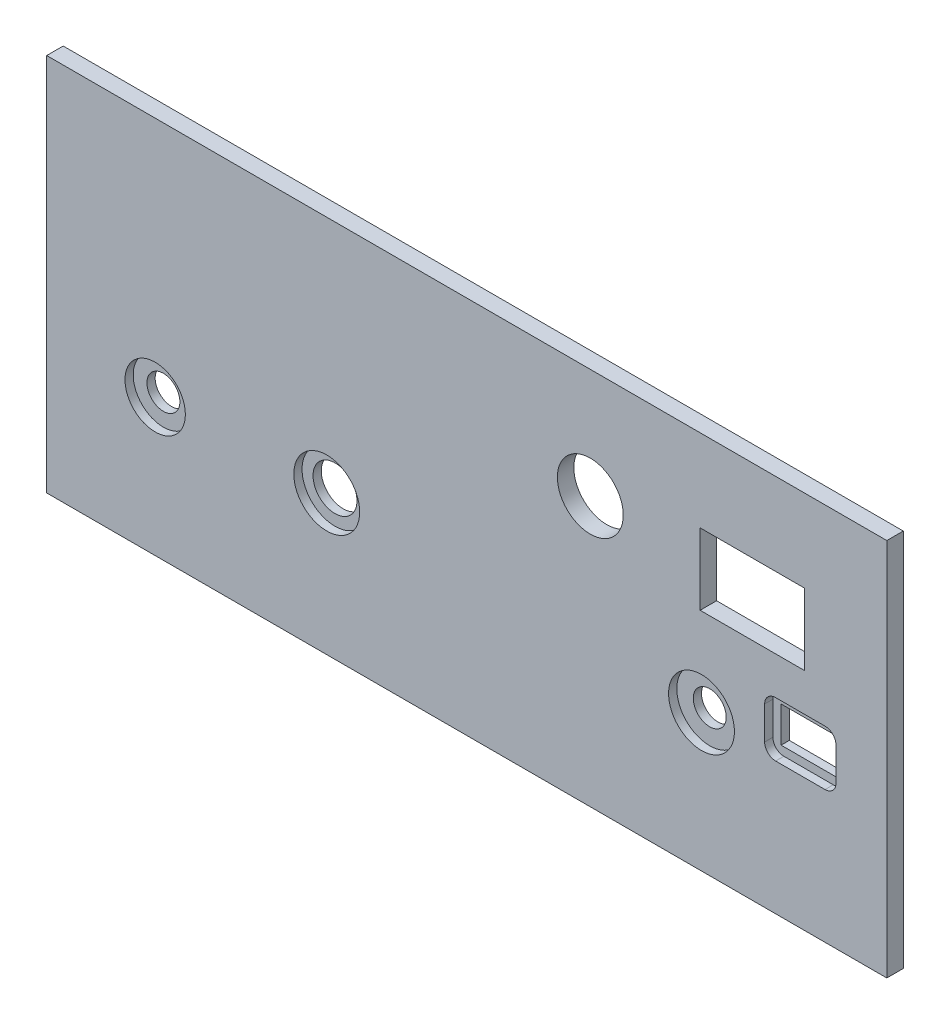
ISO-10303-21;
HEADER;
FILE_DESCRIPTION(('STEP AP214'),'2;1');
FILE_NAME('part.step','',(''),(''),'','','');
FILE_SCHEMA(('AUTOMOTIVE_DESIGN { 1 0 10303 214 1 1 1 1 }'));
ENDSEC;
DATA;
#1=APPLICATION_CONTEXT('core data for automotive mechanical design processes');
#2=APPLICATION_PROTOCOL_DEFINITION('international standard','automotive_design',2000,#1);
#3=PRODUCT_CONTEXT('',#1,'mechanical');
#4=PRODUCT('Part','Part','',(#3));
#5=PRODUCT_RELATED_PRODUCT_CATEGORY('part','',(#4));
#6=PRODUCT_DEFINITION_FORMATION('','',#4);
#7=PRODUCT_DEFINITION_CONTEXT('part definition',#1,'design');
#8=PRODUCT_DEFINITION('design','',#6,#7);
#9=PRODUCT_DEFINITION_SHAPE('','',#8);
#10=(LENGTH_UNIT() NAMED_UNIT(*) SI_UNIT(.MILLI.,.METRE.));
#11=(NAMED_UNIT(*) PLANE_ANGLE_UNIT() SI_UNIT($,.RADIAN.));
#12=(NAMED_UNIT(*) SI_UNIT($,.STERADIAN.) SOLID_ANGLE_UNIT());
#13=UNCERTAINTY_MEASURE_WITH_UNIT(LENGTH_MEASURE(1.E-05),#10,'distance_accuracy_value','');
#14=(GEOMETRIC_REPRESENTATION_CONTEXT(3) GLOBAL_UNCERTAINTY_ASSIGNED_CONTEXT((#13)) GLOBAL_UNIT_ASSIGNED_CONTEXT((#10,
#11,#12)) REPRESENTATION_CONTEXT('',''));
#15=CARTESIAN_POINT('',(0.,0.,0.));
#16=DIRECTION('',(0.,0.,1.));
#17=DIRECTION('',(1.,0.,0.));
#18=AXIS2_PLACEMENT_3D('',#15,#16,#17);
#19=CARTESIAN_POINT('',(-33.75,25.,0.));
#20=DIRECTION('',(0.,0.,1.));
#21=DIRECTION('',(1.,0.,0.));
#22=AXIS2_PLACEMENT_3D('',#19,#20,#21);
#23=CYLINDRICAL_SURFACE('',#22,3.);
#24=CARTESIAN_POINT('',(-33.75,25.,0.));
#25=DIRECTION('',(0.,0.,1.));
#26=DIRECTION('',(1.,0.,0.));
#27=AXIS2_PLACEMENT_3D('',#24,#25,#26);
#28=CIRCLE('',#27,3.);
#29=CARTESIAN_POINT('',(-30.75,25.,0.));
#30=VERTEX_POINT('',#29);
#31=EDGE_CURVE('E264',#30,#30,#28,.T.);
#32=ORIENTED_EDGE('',*,*,#31,.F.);
#33=EDGE_LOOP('',(#32));
#34=FACE_BOUND('',#33,.T.);
#35=CARTESIAN_POINT('',(-33.75,25.,1.5));
#36=DIRECTION('',(0.,0.,1.));
#37=DIRECTION('',(1.,0.,0.));
#38=AXIS2_PLACEMENT_3D('',#35,#36,#37);
#39=CIRCLE('',#38,3.);
#40=CARTESIAN_POINT('',(-30.75,25.,1.5));
#41=VERTEX_POINT('',#40);
#42=EDGE_CURVE('E291',#41,#41,#39,.F.);
#43=ORIENTED_EDGE('',*,*,#42,.F.);
#44=EDGE_LOOP('',(#43));
#45=FACE_BOUND('',#44,.T.);
#46=ADVANCED_FACE('F36',(#34,#45),#23,.F.);
#47=CARTESIAN_POINT('',(-102.,25.5,0.));
#48=DIRECTION('',(0.,0.,1.));
#49=DIRECTION('',(1.,0.,0.));
#50=AXIS2_PLACEMENT_3D('',#47,#48,#49);
#51=CYLINDRICAL_SURFACE('',#50,4.00000000000001);
#52=CARTESIAN_POINT('',(-102.,25.5,0.));
#53=DIRECTION('',(0.,0.,1.));
#54=DIRECTION('',(1.,0.,0.));
#55=AXIS2_PLACEMENT_3D('',#52,#53,#54);
#56=CIRCLE('',#55,4.00000000000001);
#57=CARTESIAN_POINT('',(-98.,25.5,0.));
#58=VERTEX_POINT('',#57);
#59=EDGE_CURVE('E261',#58,#58,#56,.T.);
#60=ORIENTED_EDGE('',*,*,#59,.F.);
#61=EDGE_LOOP('',(#60));
#62=FACE_BOUND('',#61,.T.);
#63=CARTESIAN_POINT('',(-102.,25.5,1.5));
#64=DIRECTION('',(0.,0.,1.));
#65=DIRECTION('',(1.,0.,0.));
#66=AXIS2_PLACEMENT_3D('',#63,#64,#65);
#67=CIRCLE('',#66,4.00000000000001);
#68=CARTESIAN_POINT('',(-98.,25.5,1.5));
#69=VERTEX_POINT('',#68);
#70=EDGE_CURVE('E338',#69,#69,#67,.F.);
#71=ORIENTED_EDGE('',*,*,#70,.F.);
#72=EDGE_LOOP('',(#71));
#73=FACE_BOUND('',#72,.T.);
#74=ADVANCED_FACE('F413',(#62,#73),#51,.F.);
#75=CARTESIAN_POINT('',(-133.25,25.,0.));
#76=DIRECTION('',(0.,0.,1.));
#77=DIRECTION('',(1.,0.,0.));
#78=AXIS2_PLACEMENT_3D('',#75,#76,#77);
#79=CYLINDRICAL_SURFACE('',#78,2.99999999999999);
#80=CARTESIAN_POINT('',(-133.25,25.,0.));
#81=DIRECTION('',(0.,0.,1.));
#82=DIRECTION('',(1.,0.,0.));
#83=AXIS2_PLACEMENT_3D('',#80,#81,#82);
#84=CIRCLE('',#83,2.99999999999999);
#85=CARTESIAN_POINT('',(-130.25,25.,0.));
#86=VERTEX_POINT('',#85);
#87=EDGE_CURVE('E257',#86,#86,#84,.T.);
#88=ORIENTED_EDGE('',*,*,#87,.F.);
#89=EDGE_LOOP('',(#88));
#90=FACE_BOUND('',#89,.T.);
#91=CARTESIAN_POINT('',(-133.25,25.,1.5));
#92=DIRECTION('',(0.,0.,1.));
#93=DIRECTION('',(1.,0.,0.));
#94=AXIS2_PLACEMENT_3D('',#91,#92,#93);
#95=CIRCLE('',#94,2.99999999999999);
#96=CARTESIAN_POINT('',(-130.25,25.,1.5));
#97=VERTEX_POINT('',#96);
#98=EDGE_CURVE('E242',#97,#97,#95,.F.);
#99=ORIENTED_EDGE('',*,*,#98,.F.);
#100=EDGE_LOOP('',(#99));
#101=FACE_BOUND('',#100,.T.);
#102=ADVANCED_FACE('F419',(#90,#101),#79,.F.);
#103=CARTESIAN_POINT('',(0.,0.,3.));
#104=DIRECTION('',(-1.,0.,0.));
#105=DIRECTION('',(0.,-1.,0.));
#106=AXIS2_PLACEMENT_3D('',#103,#104,#105);
#107=PLANE('',#106);
#108=DIRECTION('',(0.,1.,0.));
#109=VECTOR('',#108,1.);
#110=CARTESIAN_POINT('',(0.,0.,0.));
#111=LINE('',#110,#109);
#112=CARTESIAN_POINT('',(0.,0.,0.));
#113=VERTEX_POINT('',#112);
#114=CARTESIAN_POINT('',(0.,69.,0.));
#115=VERTEX_POINT('',#114);
#116=EDGE_CURVE('E260',#113,#115,#111,.T.);
#117=ORIENTED_EDGE('',*,*,#116,.T.);
#118=DIRECTION('',(0.,0.,-1.));
#119=VECTOR('',#118,1.);
#120=CARTESIAN_POINT('',(0.,69.,3.));
#121=LINE('',#120,#119);
#122=CARTESIAN_POINT('',(0.,69.,3.));
#123=VERTEX_POINT('',#122);
#124=EDGE_CURVE('E332',#123,#115,#121,.T.);
#125=ORIENTED_EDGE('',*,*,#124,.F.);
#126=DIRECTION('',(0.,1.,0.));
#127=VECTOR('',#126,1.);
#128=CARTESIAN_POINT('',(0.,0.,3.));
#129=LINE('',#128,#127);
#130=CARTESIAN_POINT('',(0.,0.,3.));
#131=VERTEX_POINT('',#130);
#132=EDGE_CURVE('E306',#131,#123,#129,.T.);
#133=ORIENTED_EDGE('',*,*,#132,.F.);
#134=DIRECTION('',(0.,0.,-1.));
#135=VECTOR('',#134,1.);
#136=CARTESIAN_POINT('',(0.,0.,3.));
#137=LINE('',#136,#135);
#138=EDGE_CURVE('E316',#131,#113,#137,.T.);
#139=ORIENTED_EDGE('',*,*,#138,.T.);
#140=EDGE_LOOP('',(#117,#125,#133,#139));
#141=FACE_BOUND('',#140,.T.);
#142=ADVANCED_FACE('F462',(#141),#107,.F.);
#143=CARTESIAN_POINT('',(0.,69.,3.));
#144=DIRECTION('',(0.,-1.,0.));
#145=DIRECTION('',(1.,0.,0.));
#146=AXIS2_PLACEMENT_3D('',#143,#144,#145);
#147=PLANE('',#146);
#148=DIRECTION('',(-1.,0.,0.));
#149=VECTOR('',#148,1.);
#150=CARTESIAN_POINT('',(0.,69.,0.));
#151=LINE('',#150,#149);
#152=CARTESIAN_POINT('',(-153.,69.,0.));
#153=VERTEX_POINT('',#152);
#154=EDGE_CURVE('E319',#115,#153,#151,.T.);
#155=ORIENTED_EDGE('',*,*,#154,.T.);
#156=DIRECTION('',(0.,0.,-1.));
#157=VECTOR('',#156,1.);
#158=CARTESIAN_POINT('',(-153.,69.,3.));
#159=LINE('',#158,#157);
#160=CARTESIAN_POINT('',(-153.,69.,3.));
#161=VERTEX_POINT('',#160);
#162=EDGE_CURVE('E329',#161,#153,#159,.T.);
#163=ORIENTED_EDGE('',*,*,#162,.F.);
#164=DIRECTION('',(-1.,0.,0.));
#165=VECTOR('',#164,1.);
#166=CARTESIAN_POINT('',(0.,69.,3.));
#167=LINE('',#166,#165);
#168=EDGE_CURVE('E309',#123,#161,#167,.T.);
#169=ORIENTED_EDGE('',*,*,#168,.F.);
#170=ORIENTED_EDGE('',*,*,#124,.T.);
#171=EDGE_LOOP('',(#155,#163,#169,#170));
#172=FACE_BOUND('',#171,.T.);
#173=ADVANCED_FACE('F458',(#172),#147,.F.);
#174=CARTESIAN_POINT('',(-153.,0.,3.));
#175=DIRECTION('',(1.,0.,0.));
#176=DIRECTION('',(0.,0.,-1.));
#177=AXIS2_PLACEMENT_3D('',#174,#175,#176);
#178=PLANE('',#177);
#179=DIRECTION('',(0.,-1.,0.));
#180=VECTOR('',#179,1.);
#181=CARTESIAN_POINT('',(-153.,0.,0.));
#182=LINE('',#181,#180);
#183=CARTESIAN_POINT('',(-153.,0.,0.));
#184=VERTEX_POINT('',#183);
#185=EDGE_CURVE('E321',#153,#184,#182,.T.);
#186=ORIENTED_EDGE('',*,*,#185,.T.);
#187=DIRECTION('',(0.,0.,-1.));
#188=VECTOR('',#187,1.);
#189=CARTESIAN_POINT('',(-153.,0.,3.));
#190=LINE('',#189,#188);
#191=CARTESIAN_POINT('',(-153.,0.,3.));
#192=VERTEX_POINT('',#191);
#193=EDGE_CURVE('E326',#192,#184,#190,.T.);
#194=ORIENTED_EDGE('',*,*,#193,.F.);
#195=DIRECTION('',(0.,-1.,0.));
#196=VECTOR('',#195,1.);
#197=CARTESIAN_POINT('',(-153.,0.,3.));
#198=LINE('',#197,#196);
#199=EDGE_CURVE('E312',#161,#192,#198,.T.);
#200=ORIENTED_EDGE('',*,*,#199,.F.);
#201=ORIENTED_EDGE('',*,*,#162,.T.);
#202=EDGE_LOOP('',(#186,#194,#200,#201));
#203=FACE_BOUND('',#202,.T.);
#204=ADVANCED_FACE('F454',(#203),#178,.F.);
#205=CARTESIAN_POINT('',(0.,0.,3.));
#206=DIRECTION('',(0.,1.,0.));
#207=DIRECTION('',(0.,0.,1.));
#208=AXIS2_PLACEMENT_3D('',#205,#206,#207);
#209=PLANE('',#208);
#210=DIRECTION('',(1.,0.,0.));
#211=VECTOR('',#210,1.);
#212=CARTESIAN_POINT('',(0.,0.,0.));
#213=LINE('',#212,#211);
#214=EDGE_CURVE('E310',#184,#113,#213,.T.);
#215=ORIENTED_EDGE('',*,*,#214,.T.);
#216=ORIENTED_EDGE('',*,*,#138,.F.);
#217=DIRECTION('',(1.,0.,0.));
#218=VECTOR('',#217,1.);
#219=CARTESIAN_POINT('',(0.,0.,3.));
#220=LINE('',#219,#218);
#221=EDGE_CURVE('E314',#192,#131,#220,.T.);
#222=ORIENTED_EDGE('',*,*,#221,.F.);
#223=ORIENTED_EDGE('',*,*,#193,.T.);
#224=EDGE_LOOP('',(#215,#216,#222,#223));
#225=FACE_BOUND('',#224,.T.);
#226=ADVANCED_FACE('F449',(#225),#209,.F.);
#227=CARTESIAN_POINT('',(0.,0.,3.));
#228=DIRECTION('',(0.,0.,1.));
#229=DIRECTION('',(1.,0.,0.));
#230=AXIS2_PLACEMENT_3D('',#227,#228,#229);
#231=PLANE('',#230);
#232=DIRECTION('',(0.,-1.,0.));
#233=VECTOR('',#232,1.);
#234=CARTESIAN_POINT('',(-22.25,34.1,3.));
#235=LINE('',#234,#233);
#236=CARTESIAN_POINT('',(-22.25,32.1,3.));
#237=VERTEX_POINT('',#236);
#238=CARTESIAN_POINT('',(-22.25,26.1,3.));
#239=VERTEX_POINT('',#238);
#240=EDGE_CURVE('E211',#237,#239,#235,.T.);
#241=ORIENTED_EDGE('',*,*,#240,.F.);
#242=CARTESIAN_POINT('',(-20.25,32.1,3.));
#243=DIRECTION('',(0.,0.,1.));
#244=DIRECTION('',(1.,0.,0.));
#245=AXIS2_PLACEMENT_3D('',#242,#243,#244);
#246=CIRCLE('',#245,2.);
#247=CARTESIAN_POINT('',(-20.25,34.1,3.));
#248=VERTEX_POINT('',#247);
#249=EDGE_CURVE('E44',#237,#248,#246,.F.);
#250=ORIENTED_EDGE('',*,*,#249,.T.);
#251=DIRECTION('',(-1.,0.,0.));
#252=VECTOR('',#251,1.);
#253=CARTESIAN_POINT('',(-22.25,34.1,3.));
#254=LINE('',#253,#252);
#255=CARTESIAN_POINT('',(-11.25,34.1,3.));
#256=VERTEX_POINT('',#255);
#257=EDGE_CURVE('E220',#256,#248,#254,.T.);
#258=ORIENTED_EDGE('',*,*,#257,.F.);
#259=CARTESIAN_POINT('',(-11.25,32.1,3.));
#260=DIRECTION('',(0.,0.,1.));
#261=DIRECTION('',(1.,0.,0.));
#262=AXIS2_PLACEMENT_3D('',#259,#260,#261);
#263=CIRCLE('',#262,2.);
#264=CARTESIAN_POINT('',(-9.25,32.1,3.));
#265=VERTEX_POINT('',#264);
#266=EDGE_CURVE('E11',#256,#265,#263,.F.);
#267=ORIENTED_EDGE('',*,*,#266,.T.);
#268=DIRECTION('',(0.,1.,0.));
#269=VECTOR('',#268,1.);
#270=CARTESIAN_POINT('',(-9.25,34.1,3.));
#271=LINE('',#270,#269);
#272=CARTESIAN_POINT('',(-9.25,26.1,3.));
#273=VERTEX_POINT('',#272);
#274=EDGE_CURVE('E235',#273,#265,#271,.T.);
#275=ORIENTED_EDGE('',*,*,#274,.F.);
#276=CARTESIAN_POINT('',(-11.25,26.1,3.));
#277=DIRECTION('',(0.,0.,1.));
#278=DIRECTION('',(1.,0.,0.));
#279=AXIS2_PLACEMENT_3D('',#276,#277,#278);
#280=CIRCLE('',#279,2.);
#281=CARTESIAN_POINT('',(-11.25,24.1,3.));
#282=VERTEX_POINT('',#281);
#283=EDGE_CURVE('E369',#273,#282,#280,.F.);
#284=ORIENTED_EDGE('',*,*,#283,.T.);
#285=DIRECTION('',(1.,0.,0.));
#286=VECTOR('',#285,1.);
#287=CARTESIAN_POINT('',(-22.25,24.1,3.));
#288=LINE('',#287,#286);
#289=CARTESIAN_POINT('',(-20.25,24.1,3.));
#290=VERTEX_POINT('',#289);
#291=EDGE_CURVE('E232',#290,#282,#288,.T.);
#292=ORIENTED_EDGE('',*,*,#291,.F.);
#293=CARTESIAN_POINT('',(-20.25,26.1,3.));
#294=DIRECTION('',(0.,0.,1.));
#295=DIRECTION('',(1.,0.,0.));
#296=AXIS2_PLACEMENT_3D('',#293,#294,#295);
#297=CIRCLE('',#296,2.);
#298=EDGE_CURVE('E371',#290,#239,#297,.F.);
#299=ORIENTED_EDGE('',*,*,#298,.T.);
#300=EDGE_LOOP('',(#241,#250,#258,#267,#275,#284,#292,#299));
#301=FACE_BOUND('',#300,.T.);
#302=CARTESIAN_POINT('',(-133.25,25.,3.));
#303=DIRECTION('',(0.,0.,1.));
#304=DIRECTION('',(1.,0.,0.));
#305=AXIS2_PLACEMENT_3D('',#302,#303,#304);
#306=CIRCLE('',#305,5.50000000000002);
#307=CARTESIAN_POINT('',(-127.75,25.,3.));
#308=VERTEX_POINT('',#307);
#309=EDGE_CURVE('E243',#308,#308,#306,.T.);
#310=ORIENTED_EDGE('',*,*,#309,.F.);
#311=EDGE_LOOP('',(#310));
#312=FACE_BOUND('',#311,.T.);
#313=CARTESIAN_POINT('',(-102.,25.5,3.));
#314=DIRECTION('',(0.,0.,1.));
#315=DIRECTION('',(1.,0.,0.));
#316=AXIS2_PLACEMENT_3D('',#313,#314,#315);
#317=CIRCLE('',#316,6.);
#318=CARTESIAN_POINT('',(-96.,25.5,3.));
#319=VERTEX_POINT('',#318);
#320=EDGE_CURVE('E249',#319,#319,#317,.T.);
#321=ORIENTED_EDGE('',*,*,#320,.F.);
#322=EDGE_LOOP('',(#321));
#323=FACE_BOUND('',#322,.T.);
#324=CARTESIAN_POINT('',(-33.75,25.,3.));
#325=DIRECTION('',(0.,0.,1.));
#326=DIRECTION('',(1.,0.,0.));
#327=AXIS2_PLACEMENT_3D('',#324,#325,#326);
#328=CIRCLE('',#327,6.);
#329=CARTESIAN_POINT('',(-27.75,25.,3.));
#330=VERTEX_POINT('',#329);
#331=EDGE_CURVE('E229',#330,#330,#328,.T.);
#332=ORIENTED_EDGE('',*,*,#331,.F.);
#333=EDGE_LOOP('',(#332));
#334=FACE_BOUND('',#333,.T.);
#335=CARTESIAN_POINT('',(-54.,49.,3.));
#336=DIRECTION('',(0.,0.,1.));
#337=DIRECTION('',(1.,0.,0.));
#338=AXIS2_PLACEMENT_3D('',#335,#336,#337);
#339=CIRCLE('',#338,5.99999999999999);
#340=CARTESIAN_POINT('',(-48.,49.,3.));
#341=VERTEX_POINT('',#340);
#342=EDGE_CURVE('E270',#341,#341,#339,.T.);
#343=ORIENTED_EDGE('',*,*,#342,.F.);
#344=EDGE_LOOP('',(#343));
#345=FACE_BOUND('',#344,.T.);
#346=DIRECTION('',(0.,-1.,0.));
#347=VECTOR('',#346,1.);
#348=CARTESIAN_POINT('',(-34.,54.,3.));
#349=LINE('',#348,#347);
#350=CARTESIAN_POINT('',(-34.,54.,3.));
#351=VERTEX_POINT('',#350);
#352=CARTESIAN_POINT('',(-34.,41.,3.));
#353=VERTEX_POINT('',#352);
#354=EDGE_CURVE('E288',#351,#353,#349,.T.);
#355=ORIENTED_EDGE('',*,*,#354,.F.);
#356=DIRECTION('',(-1.,0.,0.));
#357=VECTOR('',#356,1.);
#358=CARTESIAN_POINT('',(-34.,54.,3.));
#359=LINE('',#358,#357);
#360=CARTESIAN_POINT('',(-15.,54.,3.));
#361=VERTEX_POINT('',#360);
#362=EDGE_CURVE('E278',#361,#351,#359,.T.);
#363=ORIENTED_EDGE('',*,*,#362,.F.);
#364=DIRECTION('',(0.,1.,0.));
#365=VECTOR('',#364,1.);
#366=CARTESIAN_POINT('',(-15.,54.,3.));
#367=LINE('',#366,#365);
#368=CARTESIAN_POINT('',(-15.,41.,3.));
#369=VERTEX_POINT('',#368);
#370=EDGE_CURVE('E294',#369,#361,#367,.T.);
#371=ORIENTED_EDGE('',*,*,#370,.F.);
#372=DIRECTION('',(1.,0.,0.));
#373=VECTOR('',#372,1.);
#374=CARTESIAN_POINT('',(-34.,41.,3.));
#375=LINE('',#374,#373);
#376=EDGE_CURVE('E290',#353,#369,#375,.T.);
#377=ORIENTED_EDGE('',*,*,#376,.F.);
#378=EDGE_LOOP('',(#355,#363,#371,#377));
#379=FACE_BOUND('',#378,.T.);
#380=ORIENTED_EDGE('',*,*,#132,.T.);
#381=ORIENTED_EDGE('',*,*,#168,.T.);
#382=ORIENTED_EDGE('',*,*,#199,.T.);
#383=ORIENTED_EDGE('',*,*,#221,.T.);
#384=EDGE_LOOP('',(#380,#381,#382,#383));
#385=FACE_BOUND('',#384,.T.);
#386=ADVANCED_FACE('F373',(#301,#312,#323,#334,#345,#379,#385),#231,.T.);
#387=CARTESIAN_POINT('',(0.,0.,0.));
#388=DIRECTION('',(0.,0.,1.));
#389=DIRECTION('',(1.,0.,0.));
#390=AXIS2_PLACEMENT_3D('',#387,#388,#389);
#391=PLANE('',#390);
#392=DIRECTION('',(-1.,0.,0.));
#393=VECTOR('',#392,1.);
#394=CARTESIAN_POINT('',(-20.75,32.1,0.));
#395=LINE('',#394,#393);
#396=CARTESIAN_POINT('',(-10.75,32.1,0.));
#397=VERTEX_POINT('',#396);
#398=CARTESIAN_POINT('',(-20.75,32.1,0.));
#399=VERTEX_POINT('',#398);
#400=EDGE_CURVE('E184',#397,#399,#395,.T.);
#401=ORIENTED_EDGE('',*,*,#400,.T.);
#402=DIRECTION('',(0.,-1.,0.));
#403=VECTOR('',#402,1.);
#404=CARTESIAN_POINT('',(-20.75,32.1,0.));
#405=LINE('',#404,#403);
#406=CARTESIAN_POINT('',(-20.75,25.6,0.));
#407=VERTEX_POINT('',#406);
#408=EDGE_CURVE('E176',#399,#407,#405,.T.);
#409=ORIENTED_EDGE('',*,*,#408,.T.);
#410=DIRECTION('',(1.,0.,0.));
#411=VECTOR('',#410,1.);
#412=CARTESIAN_POINT('',(-20.75,25.6,0.));
#413=LINE('',#412,#411);
#414=CARTESIAN_POINT('',(-10.75,25.6,0.));
#415=VERTEX_POINT('',#414);
#416=EDGE_CURVE('E188',#407,#415,#413,.T.);
#417=ORIENTED_EDGE('',*,*,#416,.T.);
#418=DIRECTION('',(0.,1.,0.));
#419=VECTOR('',#418,1.);
#420=CARTESIAN_POINT('',(-10.75,32.1,0.));
#421=LINE('',#420,#419);
#422=EDGE_CURVE('E192',#415,#397,#421,.T.);
#423=ORIENTED_EDGE('',*,*,#422,.T.);
#424=EDGE_LOOP('',(#401,#409,#417,#423));
#425=FACE_BOUND('',#424,.T.);
#426=ORIENTED_EDGE('',*,*,#87,.T.);
#427=EDGE_LOOP('',(#426));
#428=FACE_BOUND('',#427,.T.);
#429=ORIENTED_EDGE('',*,*,#59,.T.);
#430=EDGE_LOOP('',(#429));
#431=FACE_BOUND('',#430,.T.);
#432=ORIENTED_EDGE('',*,*,#31,.T.);
#433=EDGE_LOOP('',(#432));
#434=FACE_BOUND('',#433,.T.);
#435=CARTESIAN_POINT('',(-54.,49.,0.));
#436=DIRECTION('',(0.,0.,1.));
#437=DIRECTION('',(1.,0.,0.));
#438=AXIS2_PLACEMENT_3D('',#435,#436,#437);
#439=CIRCLE('',#438,5.99999999999999);
#440=CARTESIAN_POINT('',(-48.,49.,0.));
#441=VERTEX_POINT('',#440);
#442=EDGE_CURVE('E267',#441,#441,#439,.T.);
#443=ORIENTED_EDGE('',*,*,#442,.T.);
#444=EDGE_LOOP('',(#443));
#445=FACE_BOUND('',#444,.T.);
#446=DIRECTION('',(-1.,0.,0.));
#447=VECTOR('',#446,1.);
#448=CARTESIAN_POINT('',(-34.,54.,0.));
#449=LINE('',#448,#447);
#450=CARTESIAN_POINT('',(-15.,54.,0.));
#451=VERTEX_POINT('',#450);
#452=CARTESIAN_POINT('',(-34.,54.,0.));
#453=VERTEX_POINT('',#452);
#454=EDGE_CURVE('E284',#451,#453,#449,.T.);
#455=ORIENTED_EDGE('',*,*,#454,.T.);
#456=DIRECTION('',(0.,-1.,0.));
#457=VECTOR('',#456,1.);
#458=CARTESIAN_POINT('',(-34.,54.,0.));
#459=LINE('',#458,#457);
#460=CARTESIAN_POINT('',(-34.,41.,0.));
#461=VERTEX_POINT('',#460);
#462=EDGE_CURVE('E274',#453,#461,#459,.T.);
#463=ORIENTED_EDGE('',*,*,#462,.T.);
#464=DIRECTION('',(1.,0.,0.));
#465=VECTOR('',#464,1.);
#466=CARTESIAN_POINT('',(-34.,41.,0.));
#467=LINE('',#466,#465);
#468=CARTESIAN_POINT('',(-15.,41.,0.));
#469=VERTEX_POINT('',#468);
#470=EDGE_CURVE('E277',#461,#469,#467,.T.);
#471=ORIENTED_EDGE('',*,*,#470,.T.);
#472=DIRECTION('',(0.,1.,0.));
#473=VECTOR('',#472,1.);
#474=CARTESIAN_POINT('',(-15.,54.,0.));
#475=LINE('',#474,#473);
#476=EDGE_CURVE('E281',#469,#451,#475,.T.);
#477=ORIENTED_EDGE('',*,*,#476,.T.);
#478=EDGE_LOOP('',(#455,#463,#471,#477));
#479=FACE_BOUND('',#478,.T.);
#480=ORIENTED_EDGE('',*,*,#116,.F.);
#481=ORIENTED_EDGE('',*,*,#214,.F.);
#482=ORIENTED_EDGE('',*,*,#185,.F.);
#483=ORIENTED_EDGE('',*,*,#154,.F.);
#484=EDGE_LOOP('',(#480,#481,#482,#483));
#485=FACE_BOUND('',#484,.T.);
#486=ADVANCED_FACE('F194',(#425,#428,#431,#434,#445,#479,#485),#391,.F.);
#487=CARTESIAN_POINT('',(-34.,54.,0.));
#488=DIRECTION('',(-1.,0.,0.));
#489=DIRECTION('',(0.,0.,1.));
#490=AXIS2_PLACEMENT_3D('',#487,#488,#489);
#491=PLANE('',#490);
#492=ORIENTED_EDGE('',*,*,#354,.T.);
#493=DIRECTION('',(0.,0.,1.));
#494=VECTOR('',#493,1.);
#495=CARTESIAN_POINT('',(-34.,41.,0.));
#496=LINE('',#495,#494);
#497=EDGE_CURVE('E287',#461,#353,#496,.T.);
#498=ORIENTED_EDGE('',*,*,#497,.F.);
#499=ORIENTED_EDGE('',*,*,#462,.F.);
#500=DIRECTION('',(0.,0.,1.));
#501=VECTOR('',#500,1.);
#502=CARTESIAN_POINT('',(-34.,54.,0.));
#503=LINE('',#502,#501);
#504=EDGE_CURVE('E273',#453,#351,#503,.T.);
#505=ORIENTED_EDGE('',*,*,#504,.T.);
#506=EDGE_LOOP('',(#492,#498,#499,#505));
#507=FACE_BOUND('',#506,.T.);
#508=ADVANCED_FACE('F436',(#507),#491,.F.);
#509=CARTESIAN_POINT('',(-34.,54.,0.));
#510=DIRECTION('',(0.,1.,0.));
#511=DIRECTION('',(0.,0.,1.));
#512=AXIS2_PLACEMENT_3D('',#509,#510,#511);
#513=PLANE('',#512);
#514=ORIENTED_EDGE('',*,*,#362,.T.);
#515=ORIENTED_EDGE('',*,*,#504,.F.);
#516=ORIENTED_EDGE('',*,*,#454,.F.);
#517=DIRECTION('',(0.,0.,1.));
#518=VECTOR('',#517,1.);
#519=CARTESIAN_POINT('',(-15.,54.,0.));
#520=LINE('',#519,#518);
#521=EDGE_CURVE('E300',#451,#361,#520,.T.);
#522=ORIENTED_EDGE('',*,*,#521,.T.);
#523=EDGE_LOOP('',(#514,#515,#516,#522));
#524=FACE_BOUND('',#523,.T.);
#525=ADVANCED_FACE('F432',(#524),#513,.F.);
#526=CARTESIAN_POINT('',(-15.,54.,0.));
#527=DIRECTION('',(1.,0.,0.));
#528=DIRECTION('',(0.,1.,0.));
#529=AXIS2_PLACEMENT_3D('',#526,#527,#528);
#530=PLANE('',#529);
#531=ORIENTED_EDGE('',*,*,#370,.T.);
#532=ORIENTED_EDGE('',*,*,#521,.F.);
#533=ORIENTED_EDGE('',*,*,#476,.F.);
#534=DIRECTION('',(0.,0.,1.));
#535=VECTOR('',#534,1.);
#536=CARTESIAN_POINT('',(-15.,41.,0.));
#537=LINE('',#536,#535);
#538=EDGE_CURVE('E302',#469,#369,#537,.T.);
#539=ORIENTED_EDGE('',*,*,#538,.T.);
#540=EDGE_LOOP('',(#531,#532,#533,#539));
#541=FACE_BOUND('',#540,.T.);
#542=ADVANCED_FACE('F435',(#541),#530,.F.);
#543=CARTESIAN_POINT('',(-34.,41.,0.));
#544=DIRECTION('',(0.,-1.,0.));
#545=DIRECTION('',(0.,0.,-1.));
#546=AXIS2_PLACEMENT_3D('',#543,#544,#545);
#547=PLANE('',#546);
#548=ORIENTED_EDGE('',*,*,#376,.T.);
#549=ORIENTED_EDGE('',*,*,#538,.F.);
#550=ORIENTED_EDGE('',*,*,#470,.F.);
#551=ORIENTED_EDGE('',*,*,#497,.T.);
#552=EDGE_LOOP('',(#548,#549,#550,#551));
#553=FACE_BOUND('',#552,.T.);
#554=ADVANCED_FACE('F430',(#553),#547,.F.);
#555=CARTESIAN_POINT('',(-54.,49.,0.));
#556=DIRECTION('',(0.,0.,1.));
#557=DIRECTION('',(1.,0.,0.));
#558=AXIS2_PLACEMENT_3D('',#555,#556,#557);
#559=CYLINDRICAL_SURFACE('',#558,5.99999999999999);
#560=ORIENTED_EDGE('',*,*,#442,.F.);
#561=EDGE_LOOP('',(#560));
#562=FACE_BOUND('',#561,.T.);
#563=ORIENTED_EDGE('',*,*,#342,.T.);
#564=EDGE_LOOP('',(#563));
#565=FACE_BOUND('',#564,.T.);
#566=ADVANCED_FACE('F426',(#562,#565),#559,.F.);
#567=CARTESIAN_POINT('',(-133.25,25.,1.5));
#568=DIRECTION('',(0.,0.,1.));
#569=DIRECTION('',(1.,0.,0.));
#570=AXIS2_PLACEMENT_3D('',#567,#568,#569);
#571=PLANE('',#570);
#572=CARTESIAN_POINT('',(-133.25,25.,1.5));
#573=DIRECTION('',(0.,0.,1.));
#574=DIRECTION('',(1.,0.,0.));
#575=AXIS2_PLACEMENT_3D('',#572,#573,#574);
#576=CIRCLE('',#575,5.50000000000002);
#577=CARTESIAN_POINT('',(-127.75,25.,1.5));
#578=VERTEX_POINT('',#577);
#579=EDGE_CURVE('E239',#578,#578,#576,.T.);
#580=ORIENTED_EDGE('',*,*,#579,.T.);
#581=EDGE_LOOP('',(#580));
#582=FACE_BOUND('',#581,.T.);
#583=ORIENTED_EDGE('',*,*,#98,.T.);
#584=EDGE_LOOP('',(#583));
#585=FACE_BOUND('',#584,.T.);
#586=ADVANCED_FACE('F429',(#582,#585),#571,.T.);
#587=CARTESIAN_POINT('',(-133.25,25.,1.5));
#588=DIRECTION('',(0.,0.,1.));
#589=DIRECTION('',(1.,0.,0.));
#590=AXIS2_PLACEMENT_3D('',#587,#588,#589);
#591=CYLINDRICAL_SURFACE('',#590,5.50000000000002);
#592=ORIENTED_EDGE('',*,*,#579,.F.);
#593=EDGE_LOOP('',(#592));
#594=FACE_BOUND('',#593,.T.);
#595=ORIENTED_EDGE('',*,*,#309,.T.);
#596=EDGE_LOOP('',(#595));
#597=FACE_BOUND('',#596,.T.);
#598=ADVANCED_FACE('F497',(#594,#597),#591,.F.);
#599=CARTESIAN_POINT('',(-102.,25.5,1.5));
#600=DIRECTION('',(0.,0.,1.));
#601=DIRECTION('',(1.,0.,0.));
#602=AXIS2_PLACEMENT_3D('',#599,#600,#601);
#603=PLANE('',#602);
#604=CARTESIAN_POINT('',(-102.,25.5,1.5));
#605=DIRECTION('',(0.,0.,1.));
#606=DIRECTION('',(1.,0.,0.));
#607=AXIS2_PLACEMENT_3D('',#604,#605,#606);
#608=CIRCLE('',#607,6.);
#609=CARTESIAN_POINT('',(-96.,25.5,1.5));
#610=VERTEX_POINT('',#609);
#611=EDGE_CURVE('E246',#610,#610,#608,.T.);
#612=ORIENTED_EDGE('',*,*,#611,.T.);
#613=EDGE_LOOP('',(#612));
#614=FACE_BOUND('',#613,.T.);
#615=ORIENTED_EDGE('',*,*,#70,.T.);
#616=EDGE_LOOP('',(#615));
#617=FACE_BOUND('',#616,.T.);
#618=ADVANCED_FACE('F501',(#614,#617),#603,.T.);
#619=CARTESIAN_POINT('',(-102.,25.5,1.5));
#620=DIRECTION('',(0.,0.,1.));
#621=DIRECTION('',(1.,0.,0.));
#622=AXIS2_PLACEMENT_3D('',#619,#620,#621);
#623=CYLINDRICAL_SURFACE('',#622,6.);
#624=ORIENTED_EDGE('',*,*,#611,.F.);
#625=EDGE_LOOP('',(#624));
#626=FACE_BOUND('',#625,.T.);
#627=ORIENTED_EDGE('',*,*,#320,.T.);
#628=EDGE_LOOP('',(#627));
#629=FACE_BOUND('',#628,.T.);
#630=ADVANCED_FACE('F505',(#626,#629),#623,.F.);
#631=CARTESIAN_POINT('',(-33.75,25.,1.5));
#632=DIRECTION('',(0.,0.,1.));
#633=DIRECTION('',(1.,0.,0.));
#634=AXIS2_PLACEMENT_3D('',#631,#632,#633);
#635=PLANE('',#634);
#636=CARTESIAN_POINT('',(-33.75,25.,1.5));
#637=DIRECTION('',(0.,0.,1.));
#638=DIRECTION('',(1.,0.,0.));
#639=AXIS2_PLACEMENT_3D('',#636,#637,#638);
#640=CIRCLE('',#639,6.);
#641=CARTESIAN_POINT('',(-27.75,25.,1.5));
#642=VERTEX_POINT('',#641);
#643=EDGE_CURVE('E252',#642,#642,#640,.T.);
#644=ORIENTED_EDGE('',*,*,#643,.T.);
#645=EDGE_LOOP('',(#644));
#646=FACE_BOUND('',#645,.T.);
#647=ORIENTED_EDGE('',*,*,#42,.T.);
#648=EDGE_LOOP('',(#647));
#649=FACE_BOUND('',#648,.T.);
#650=ADVANCED_FACE('F509',(#646,#649),#635,.T.);
#651=CARTESIAN_POINT('',(-33.75,25.,1.5));
#652=DIRECTION('',(0.,0.,1.));
#653=DIRECTION('',(1.,0.,0.));
#654=AXIS2_PLACEMENT_3D('',#651,#652,#653);
#655=CYLINDRICAL_SURFACE('',#654,6.);
#656=ORIENTED_EDGE('',*,*,#643,.F.);
#657=EDGE_LOOP('',(#656));
#658=FACE_BOUND('',#657,.T.);
#659=ORIENTED_EDGE('',*,*,#331,.T.);
#660=EDGE_LOOP('',(#659));
#661=FACE_BOUND('',#660,.T.);
#662=ADVANCED_FACE('F494',(#658,#661),#655,.F.);
#663=CARTESIAN_POINT('',(-22.25,34.1,1.5));
#664=DIRECTION('',(-1.,0.,0.));
#665=DIRECTION('',(0.,0.,1.));
#666=AXIS2_PLACEMENT_3D('',#663,#664,#665);
#667=PLANE('',#666);
#668=ORIENTED_EDGE('',*,*,#240,.T.);
#669=DIRECTION('',(0.,0.,1.));
#670=VECTOR('',#669,1.);
#671=CARTESIAN_POINT('',(-22.25,26.1,1.5));
#672=LINE('',#671,#670);
#673=CARTESIAN_POINT('',(-22.25,26.1,1.5));
#674=VERTEX_POINT('',#673);
#675=EDGE_CURVE('E363',#239,#674,#672,.F.);
#676=ORIENTED_EDGE('',*,*,#675,.T.);
#677=DIRECTION('',(0.,-1.,0.));
#678=VECTOR('',#677,1.);
#679=CARTESIAN_POINT('',(-22.25,34.1,1.5));
#680=LINE('',#679,#678);
#681=CARTESIAN_POINT('',(-22.25,32.1,1.5));
#682=VERTEX_POINT('',#681);
#683=EDGE_CURVE('E216',#682,#674,#680,.T.);
#684=ORIENTED_EDGE('',*,*,#683,.F.);
#685=DIRECTION('',(0.,0.,1.));
#686=VECTOR('',#685,1.);
#687=CARTESIAN_POINT('',(-22.25,32.1,3.));
#688=LINE('',#687,#686);
#689=EDGE_CURVE('E360',#682,#237,#688,.T.);
#690=ORIENTED_EDGE('',*,*,#689,.T.);
#691=EDGE_LOOP('',(#668,#676,#684,#690));
#692=FACE_BOUND('',#691,.T.);
#693=ADVANCED_FACE('F379',(#692),#667,.F.);
#694=CARTESIAN_POINT('',(-22.25,34.1,1.5));
#695=DIRECTION('',(0.,1.,0.));
#696=DIRECTION('',(-1.,0.,0.));
#697=AXIS2_PLACEMENT_3D('',#694,#695,#696);
#698=PLANE('',#697);
#699=ORIENTED_EDGE('',*,*,#257,.T.);
#700=DIRECTION('',(0.,0.,1.));
#701=VECTOR('',#700,1.);
#702=CARTESIAN_POINT('',(-20.25,34.1,1.5));
#703=LINE('',#702,#701);
#704=CARTESIAN_POINT('',(-20.25,34.1,1.5));
#705=VERTEX_POINT('',#704);
#706=EDGE_CURVE('E367',#248,#705,#703,.F.);
#707=ORIENTED_EDGE('',*,*,#706,.T.);
#708=DIRECTION('',(-1.,0.,0.));
#709=VECTOR('',#708,1.);
#710=CARTESIAN_POINT('',(-22.25,34.1,1.5));
#711=LINE('',#710,#709);
#712=CARTESIAN_POINT('',(-11.25,34.1,1.5));
#713=VERTEX_POINT('',#712);
#714=EDGE_CURVE('E226',#713,#705,#711,.T.);
#715=ORIENTED_EDGE('',*,*,#714,.F.);
#716=DIRECTION('',(0.,0.,1.));
#717=VECTOR('',#716,1.);
#718=CARTESIAN_POINT('',(-11.25,34.1,3.));
#719=LINE('',#718,#717);
#720=EDGE_CURVE('E365',#713,#256,#719,.T.);
#721=ORIENTED_EDGE('',*,*,#720,.T.);
#722=EDGE_LOOP('',(#699,#707,#715,#721));
#723=FACE_BOUND('',#722,.T.);
#724=ADVANCED_FACE('F402',(#723),#698,.F.);
#725=CARTESIAN_POINT('',(-9.25,34.1,1.5));
#726=DIRECTION('',(1.,0.,0.));
#727=DIRECTION('',(0.,1.,0.));
#728=AXIS2_PLACEMENT_3D('',#725,#726,#727);
#729=PLANE('',#728);
#730=DIRECTION('',(0.,1.,0.));
#731=VECTOR('',#730,1.);
#732=CARTESIAN_POINT('',(-9.25,34.1,1.5));
#733=LINE('',#732,#731);
#734=CARTESIAN_POINT('',(-9.25,26.1,1.5));
#735=VERTEX_POINT('',#734);
#736=CARTESIAN_POINT('',(-9.25,32.1,1.5));
#737=VERTEX_POINT('',#736);
#738=EDGE_CURVE('E223',#735,#737,#733,.T.);
#739=ORIENTED_EDGE('',*,*,#738,.F.);
#740=DIRECTION('',(0.,0.,1.));
#741=VECTOR('',#740,1.);
#742=CARTESIAN_POINT('',(-9.25,26.1,3.));
#743=LINE('',#742,#741);
#744=EDGE_CURVE('E344',#735,#273,#743,.T.);
#745=ORIENTED_EDGE('',*,*,#744,.T.);
#746=ORIENTED_EDGE('',*,*,#274,.T.);
#747=DIRECTION('',(0.,0.,1.));
#748=VECTOR('',#747,1.);
#749=CARTESIAN_POINT('',(-9.25,32.1,1.5));
#750=LINE('',#749,#748);
#751=EDGE_CURVE('E335',#265,#737,#750,.F.);
#752=ORIENTED_EDGE('',*,*,#751,.T.);
#753=EDGE_LOOP('',(#739,#745,#746,#752));
#754=FACE_BOUND('',#753,.T.);
#755=ADVANCED_FACE('F397',(#754),#729,.F.);
#756=CARTESIAN_POINT('',(-22.25,24.1,1.5));
#757=DIRECTION('',(0.,-1.,0.));
#758=DIRECTION('',(0.,0.,-1.));
#759=AXIS2_PLACEMENT_3D('',#756,#757,#758);
#760=PLANE('',#759);
#761=ORIENTED_EDGE('',*,*,#291,.T.);
#762=DIRECTION('',(0.,0.,1.));
#763=VECTOR('',#762,1.);
#764=CARTESIAN_POINT('',(-11.25,24.1,1.5));
#765=LINE('',#764,#763);
#766=CARTESIAN_POINT('',(-11.25,24.1,1.5));
#767=VERTEX_POINT('',#766);
#768=EDGE_CURVE('E350',#282,#767,#765,.F.);
#769=ORIENTED_EDGE('',*,*,#768,.T.);
#770=DIRECTION('',(1.,0.,0.));
#771=VECTOR('',#770,1.);
#772=CARTESIAN_POINT('',(-22.25,24.1,1.5));
#773=LINE('',#772,#771);
#774=CARTESIAN_POINT('',(-20.25,24.1,1.5));
#775=VERTEX_POINT('',#774);
#776=EDGE_CURVE('E219',#775,#767,#773,.T.);
#777=ORIENTED_EDGE('',*,*,#776,.F.);
#778=DIRECTION('',(0.,0.,1.));
#779=VECTOR('',#778,1.);
#780=CARTESIAN_POINT('',(-20.25,24.1,3.));
#781=LINE('',#780,#779);
#782=EDGE_CURVE('E347',#775,#290,#781,.T.);
#783=ORIENTED_EDGE('',*,*,#782,.T.);
#784=EDGE_LOOP('',(#761,#769,#777,#783));
#785=FACE_BOUND('',#784,.T.);
#786=ADVANCED_FACE('F389',(#785),#760,.F.);
#787=CARTESIAN_POINT('',(0.,0.,1.5));
#788=DIRECTION('',(0.,0.,1.));
#789=DIRECTION('',(1.,0.,0.));
#790=AXIS2_PLACEMENT_3D('',#787,#788,#789);
#791=PLANE('',#790);
#792=DIRECTION('',(0.,-1.,0.));
#793=VECTOR('',#792,1.);
#794=CARTESIAN_POINT('',(-20.75,32.1,1.5));
#795=LINE('',#794,#793);
#796=CARTESIAN_POINT('',(-20.75,32.1,1.5));
#797=VERTEX_POINT('',#796);
#798=CARTESIAN_POINT('',(-20.75,25.6,1.5));
#799=VERTEX_POINT('',#798);
#800=EDGE_CURVE('E179',#797,#799,#795,.T.);
#801=ORIENTED_EDGE('',*,*,#800,.F.);
#802=DIRECTION('',(-1.,0.,0.));
#803=VECTOR('',#802,1.);
#804=CARTESIAN_POINT('',(-20.75,32.1,1.5));
#805=LINE('',#804,#803);
#806=CARTESIAN_POINT('',(-10.75,32.1,1.5));
#807=VERTEX_POINT('',#806);
#808=EDGE_CURVE('E197',#807,#797,#805,.T.);
#809=ORIENTED_EDGE('',*,*,#808,.F.);
#810=DIRECTION('',(0.,1.,0.));
#811=VECTOR('',#810,1.);
#812=CARTESIAN_POINT('',(-10.75,32.1,1.5));
#813=LINE('',#812,#811);
#814=CARTESIAN_POINT('',(-10.75,25.6,1.5));
#815=VERTEX_POINT('',#814);
#816=EDGE_CURVE('E200',#815,#807,#813,.T.);
#817=ORIENTED_EDGE('',*,*,#816,.F.);
#818=DIRECTION('',(1.,0.,0.));
#819=VECTOR('',#818,1.);
#820=CARTESIAN_POINT('',(-20.75,25.6,1.5));
#821=LINE('',#820,#819);
#822=EDGE_CURVE('E206',#799,#815,#821,.T.);
#823=ORIENTED_EDGE('',*,*,#822,.F.);
#824=EDGE_LOOP('',(#801,#809,#817,#823));
#825=FACE_BOUND('',#824,.T.);
#826=ORIENTED_EDGE('',*,*,#776,.T.);
#827=CARTESIAN_POINT('',(-11.25,26.1,1.5));
#828=DIRECTION('',(0.,0.,1.));
#829=DIRECTION('',(1.,0.,0.));
#830=AXIS2_PLACEMENT_3D('',#827,#828,#829);
#831=CIRCLE('',#830,2.);
#832=EDGE_CURVE('E358',#767,#735,#831,.T.);
#833=ORIENTED_EDGE('',*,*,#832,.T.);
#834=ORIENTED_EDGE('',*,*,#738,.T.);
#835=CARTESIAN_POINT('',(-11.25,32.1,1.5));
#836=DIRECTION('',(0.,0.,1.));
#837=DIRECTION('',(1.,0.,0.));
#838=AXIS2_PLACEMENT_3D('',#835,#836,#837);
#839=CIRCLE('',#838,2.);
#840=EDGE_CURVE('E352',#737,#713,#839,.T.);
#841=ORIENTED_EDGE('',*,*,#840,.T.);
#842=ORIENTED_EDGE('',*,*,#714,.T.);
#843=CARTESIAN_POINT('',(-20.25,32.1,1.5));
#844=DIRECTION('',(0.,0.,1.));
#845=DIRECTION('',(1.,0.,0.));
#846=AXIS2_PLACEMENT_3D('',#843,#844,#845);
#847=CIRCLE('',#846,2.);
#848=EDGE_CURVE('E354',#705,#682,#847,.T.);
#849=ORIENTED_EDGE('',*,*,#848,.T.);
#850=ORIENTED_EDGE('',*,*,#683,.T.);
#851=CARTESIAN_POINT('',(-20.25,26.1,1.5));
#852=DIRECTION('',(0.,0.,1.));
#853=DIRECTION('',(1.,0.,0.));
#854=AXIS2_PLACEMENT_3D('',#851,#852,#853);
#855=CIRCLE('',#854,2.);
#856=EDGE_CURVE('E356',#674,#775,#855,.T.);
#857=ORIENTED_EDGE('',*,*,#856,.T.);
#858=EDGE_LOOP('',(#826,#833,#834,#841,#842,#849,#850,#857));
#859=FACE_BOUND('',#858,.T.);
#860=ADVANCED_FACE('F386',(#825,#859),#791,.T.);
#861=CARTESIAN_POINT('',(-20.75,32.1,0.));
#862=DIRECTION('',(-1.,0.,0.));
#863=DIRECTION('',(0.,0.,1.));
#864=AXIS2_PLACEMENT_3D('',#861,#862,#863);
#865=PLANE('',#864);
#866=ORIENTED_EDGE('',*,*,#800,.T.);
#867=DIRECTION('',(0.,0.,1.));
#868=VECTOR('',#867,1.);
#869=CARTESIAN_POINT('',(-20.75,25.6,0.));
#870=LINE('',#869,#868);
#871=EDGE_CURVE('E172',#407,#799,#870,.T.);
#872=ORIENTED_EDGE('',*,*,#871,.F.);
#873=ORIENTED_EDGE('',*,*,#408,.F.);
#874=DIRECTION('',(0.,0.,1.));
#875=VECTOR('',#874,1.);
#876=CARTESIAN_POINT('',(-20.75,32.1,0.));
#877=LINE('',#876,#875);
#878=EDGE_CURVE('E209',#399,#797,#877,.T.);
#879=ORIENTED_EDGE('',*,*,#878,.T.);
#880=EDGE_LOOP('',(#866,#872,#873,#879));
#881=FACE_BOUND('',#880,.T.);
#882=ADVANCED_FACE('F174',(#881),#865,.F.);
#883=CARTESIAN_POINT('',(-20.75,32.1,0.));
#884=DIRECTION('',(0.,1.,0.));
#885=DIRECTION('',(0.,0.,1.));
#886=AXIS2_PLACEMENT_3D('',#883,#884,#885);
#887=PLANE('',#886);
#888=ORIENTED_EDGE('',*,*,#808,.T.);
#889=ORIENTED_EDGE('',*,*,#878,.F.);
#890=ORIENTED_EDGE('',*,*,#400,.F.);
#891=DIRECTION('',(0.,0.,1.));
#892=VECTOR('',#891,1.);
#893=CARTESIAN_POINT('',(-10.75,32.1,0.));
#894=LINE('',#893,#892);
#895=EDGE_CURVE('E212',#397,#807,#894,.T.);
#896=ORIENTED_EDGE('',*,*,#895,.T.);
#897=EDGE_LOOP('',(#888,#889,#890,#896));
#898=FACE_BOUND('',#897,.T.);
#899=ADVANCED_FACE('F476',(#898),#887,.F.);
#900=CARTESIAN_POINT('',(-10.75,32.1,0.));
#901=DIRECTION('',(1.,0.,0.));
#902=DIRECTION('',(0.,1.,0.));
#903=AXIS2_PLACEMENT_3D('',#900,#901,#902);
#904=PLANE('',#903);
#905=ORIENTED_EDGE('',*,*,#816,.T.);
#906=ORIENTED_EDGE('',*,*,#895,.F.);
#907=ORIENTED_EDGE('',*,*,#422,.F.);
#908=DIRECTION('',(0.,0.,1.));
#909=VECTOR('',#908,1.);
#910=CARTESIAN_POINT('',(-10.75,25.6,0.));
#911=LINE('',#910,#909);
#912=EDGE_CURVE('E183',#415,#815,#911,.T.);
#913=ORIENTED_EDGE('',*,*,#912,.T.);
#914=EDGE_LOOP('',(#905,#906,#907,#913));
#915=FACE_BOUND('',#914,.T.);
#916=ADVANCED_FACE('F471',(#915),#904,.F.);
#917=CARTESIAN_POINT('',(-20.75,25.6,0.));
#918=DIRECTION('',(0.,-1.,0.));
#919=DIRECTION('',(0.,0.,-1.));
#920=AXIS2_PLACEMENT_3D('',#917,#918,#919);
#921=PLANE('',#920);
#922=ORIENTED_EDGE('',*,*,#822,.T.);
#923=ORIENTED_EDGE('',*,*,#912,.F.);
#924=ORIENTED_EDGE('',*,*,#416,.F.);
#925=ORIENTED_EDGE('',*,*,#871,.T.);
#926=EDGE_LOOP('',(#922,#923,#924,#925));
#927=FACE_BOUND('',#926,.T.);
#928=ADVANCED_FACE('F189',(#927),#921,.F.);
#929=CARTESIAN_POINT('',(-11.25,26.1,1.5));
#930=DIRECTION('',(0.,0.,-1.));
#931=DIRECTION('',(-1.,0.,0.));
#932=AXIS2_PLACEMENT_3D('',#929,#930,#931);
#933=CYLINDRICAL_SURFACE('',#932,2.);
#934=ORIENTED_EDGE('',*,*,#832,.F.);
#935=ORIENTED_EDGE('',*,*,#768,.F.);
#936=ORIENTED_EDGE('',*,*,#283,.F.);
#937=ORIENTED_EDGE('',*,*,#744,.F.);
#938=EDGE_LOOP('',(#934,#935,#936,#937));
#939=FACE_BOUND('',#938,.T.);
#940=ADVANCED_FACE('F392',(#939),#933,.F.);
#941=CARTESIAN_POINT('',(-20.25,26.1,1.5));
#942=DIRECTION('',(0.,0.,-1.));
#943=DIRECTION('',(-1.,0.,0.));
#944=AXIS2_PLACEMENT_3D('',#941,#942,#943);
#945=CYLINDRICAL_SURFACE('',#944,2.);
#946=ORIENTED_EDGE('',*,*,#856,.F.);
#947=ORIENTED_EDGE('',*,*,#675,.F.);
#948=ORIENTED_EDGE('',*,*,#298,.F.);
#949=ORIENTED_EDGE('',*,*,#782,.F.);
#950=EDGE_LOOP('',(#946,#947,#948,#949));
#951=FACE_BOUND('',#950,.T.);
#952=ADVANCED_FACE('F383',(#951),#945,.F.);
#953=CARTESIAN_POINT('',(-20.25,32.1,1.5));
#954=DIRECTION('',(0.,0.,-1.));
#955=DIRECTION('',(-1.,0.,0.));
#956=AXIS2_PLACEMENT_3D('',#953,#954,#955);
#957=CYLINDRICAL_SURFACE('',#956,2.);
#958=ORIENTED_EDGE('',*,*,#848,.F.);
#959=ORIENTED_EDGE('',*,*,#706,.F.);
#960=ORIENTED_EDGE('',*,*,#249,.F.);
#961=ORIENTED_EDGE('',*,*,#689,.F.);
#962=EDGE_LOOP('',(#958,#959,#960,#961));
#963=FACE_BOUND('',#962,.T.);
#964=ADVANCED_FACE('F405',(#963),#957,.F.);
#965=CARTESIAN_POINT('',(-11.25,32.1,1.5));
#966=DIRECTION('',(0.,0.,-1.));
#967=DIRECTION('',(-1.,0.,0.));
#968=AXIS2_PLACEMENT_3D('',#965,#966,#967);
#969=CYLINDRICAL_SURFACE('',#968,2.);
#970=ORIENTED_EDGE('',*,*,#840,.F.);
#971=ORIENTED_EDGE('',*,*,#751,.F.);
#972=ORIENTED_EDGE('',*,*,#266,.F.);
#973=ORIENTED_EDGE('',*,*,#720,.F.);
#974=EDGE_LOOP('',(#970,#971,#972,#973));
#975=FACE_BOUND('',#974,.T.);
#976=ADVANCED_FACE('F38',(#975),#969,.F.);
#977=CLOSED_SHELL('',(#46,#74,#102,#142,#173,#204,#226,#386,#486,#508,#525,#542,#554,#566,#586,
#598,#618,#630,#650,#662,#693,#724,#755,#786,#860,#882,#899,#916,#928,#940,#952,#964,#976));
#978=MANIFOLD_SOLID_BREP('B2',#977);
#979=ADVANCED_BREP_SHAPE_REPRESENTATION('',(#18,#978),#14);
#980=SHAPE_DEFINITION_REPRESENTATION(#9,#979);
ENDSEC;
END-ISO-10303-21;
